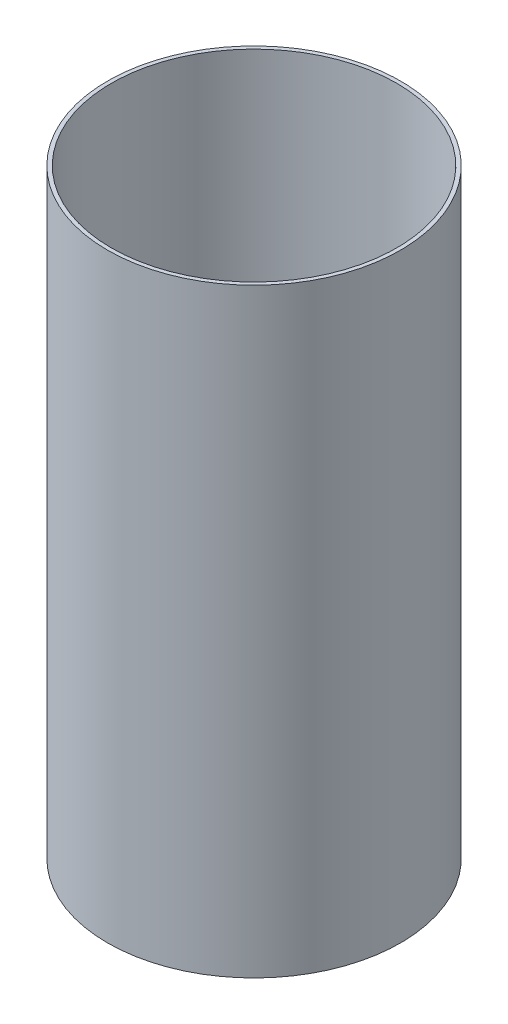
ISO-10303-21;
HEADER;
FILE_DESCRIPTION(('STEP AP214'),'2;1');
FILE_NAME('part.step','',(''),(''),'','','');
FILE_SCHEMA(('AUTOMOTIVE_DESIGN { 1 0 10303 214 1 1 1 1 }'));
ENDSEC;
DATA;
#1=APPLICATION_CONTEXT('core data for automotive mechanical design processes');
#2=APPLICATION_PROTOCOL_DEFINITION('international standard','automotive_design',2000,#1);
#3=PRODUCT_CONTEXT('',#1,'mechanical');
#4=PRODUCT('Part','Part','',(#3));
#5=PRODUCT_RELATED_PRODUCT_CATEGORY('part','',(#4));
#6=PRODUCT_DEFINITION_FORMATION('','',#4);
#7=PRODUCT_DEFINITION_CONTEXT('part definition',#1,'design');
#8=PRODUCT_DEFINITION('design','',#6,#7);
#9=PRODUCT_DEFINITION_SHAPE('','',#8);
#10=(LENGTH_UNIT() NAMED_UNIT(*) SI_UNIT(.MILLI.,.METRE.));
#11=(NAMED_UNIT(*) PLANE_ANGLE_UNIT() SI_UNIT($,.RADIAN.));
#12=(NAMED_UNIT(*) SI_UNIT($,.STERADIAN.) SOLID_ANGLE_UNIT());
#13=UNCERTAINTY_MEASURE_WITH_UNIT(LENGTH_MEASURE(1.E-05),#10,'distance_accuracy_value','');
#14=(GEOMETRIC_REPRESENTATION_CONTEXT(3) GLOBAL_UNCERTAINTY_ASSIGNED_CONTEXT((#13)) GLOBAL_UNIT_ASSIGNED_CONTEXT((#10,
#11,#12)) REPRESENTATION_CONTEXT('',''));
#15=CARTESIAN_POINT('',(0.,0.,0.));
#16=DIRECTION('',(0.,0.,1.));
#17=DIRECTION('',(1.,0.,0.));
#18=AXIS2_PLACEMENT_3D('',#15,#16,#17);
#19=CARTESIAN_POINT('',(0.,312.,0.));
#20=DIRECTION('',(0.,1.,0.));
#21=DIRECTION('',(0.,0.,1.));
#22=AXIS2_PLACEMENT_3D('',#19,#20,#21);
#23=PLANE('',#22);
#24=CARTESIAN_POINT('',(0.,312.,0.));
#25=DIRECTION('',(0.,1.,0.));
#26=DIRECTION('',(0.,0.,1.));
#27=AXIS2_PLACEMENT_3D('',#24,#25,#26);
#28=CIRCLE('',#27,76.2);
#29=CARTESIAN_POINT('',(0.,312.,76.2));
#30=VERTEX_POINT('',#29);
#31=EDGE_CURVE('E10',#30,#30,#28,.T.);
#32=ORIENTED_EDGE('',*,*,#31,.T.);
#33=EDGE_LOOP('',(#32));
#34=FACE_BOUND('',#33,.T.);
#35=CARTESIAN_POINT('',(0.,312.,0.));
#36=DIRECTION('',(0.,1.,0.));
#37=DIRECTION('',(0.,0.,1.));
#38=AXIS2_PLACEMENT_3D('',#35,#36,#37);
#39=CIRCLE('',#38,74.2);
#40=CARTESIAN_POINT('',(0.,312.,74.2));
#41=VERTEX_POINT('',#40);
#42=EDGE_CURVE('E42',#41,#41,#39,.T.);
#43=ORIENTED_EDGE('',*,*,#42,.F.);
#44=EDGE_LOOP('',(#43));
#45=FACE_BOUND('',#44,.T.);
#46=ADVANCED_FACE('F31',(#34,#45),#23,.T.);
#47=CARTESIAN_POINT('',(0.,0.,0.));
#48=DIRECTION('',(0.,1.,0.));
#49=DIRECTION('',(0.,0.,1.));
#50=AXIS2_PLACEMENT_3D('',#47,#48,#49);
#51=PLANE('',#50);
#52=CARTESIAN_POINT('',(0.,0.,0.));
#53=DIRECTION('',(0.,1.,0.));
#54=DIRECTION('',(0.,0.,1.));
#55=AXIS2_PLACEMENT_3D('',#52,#53,#54);
#56=CIRCLE('',#55,76.2);
#57=CARTESIAN_POINT('',(0.,0.,76.2));
#58=VERTEX_POINT('',#57);
#59=EDGE_CURVE('E35',#58,#58,#56,.T.);
#60=ORIENTED_EDGE('',*,*,#59,.F.);
#61=EDGE_LOOP('',(#60));
#62=FACE_BOUND('',#61,.T.);
#63=CARTESIAN_POINT('',(0.,0.,0.));
#64=DIRECTION('',(0.,1.,0.));
#65=DIRECTION('',(0.,0.,1.));
#66=AXIS2_PLACEMENT_3D('',#63,#64,#65);
#67=CIRCLE('',#66,74.2);
#68=CARTESIAN_POINT('',(0.,0.,74.2));
#69=VERTEX_POINT('',#68);
#70=EDGE_CURVE('E44',#69,#69,#67,.T.);
#71=ORIENTED_EDGE('',*,*,#70,.T.);
#72=EDGE_LOOP('',(#71));
#73=FACE_BOUND('',#72,.T.);
#74=ADVANCED_FACE('F54',(#62,#73),#51,.F.);
#75=CARTESIAN_POINT('',(0.,312.,0.));
#76=DIRECTION('',(0.,-1.,0.));
#77=DIRECTION('',(0.,0.,-1.));
#78=AXIS2_PLACEMENT_3D('',#75,#76,#77);
#79=CYLINDRICAL_SURFACE('',#78,76.2);
#80=ORIENTED_EDGE('',*,*,#31,.F.);
#81=EDGE_LOOP('',(#80));
#82=FACE_BOUND('',#81,.T.);
#83=ORIENTED_EDGE('',*,*,#59,.T.);
#84=EDGE_LOOP('',(#83));
#85=FACE_BOUND('',#84,.T.);
#86=ADVANCED_FACE('F33',(#82,#85),#79,.T.);
#87=CARTESIAN_POINT('',(0.,312.,0.));
#88=DIRECTION('',(0.,-1.,0.));
#89=DIRECTION('',(0.,0.,-1.));
#90=AXIS2_PLACEMENT_3D('',#87,#88,#89);
#91=CYLINDRICAL_SURFACE('',#90,74.2);
#92=ORIENTED_EDGE('',*,*,#42,.T.);
#93=EDGE_LOOP('',(#92));
#94=FACE_BOUND('',#93,.T.);
#95=ORIENTED_EDGE('',*,*,#70,.F.);
#96=EDGE_LOOP('',(#95));
#97=FACE_BOUND('',#96,.T.);
#98=ADVANCED_FACE('F50',(#94,#97),#91,.F.);
#99=CLOSED_SHELL('',(#46,#74,#86,#98));
#100=MANIFOLD_SOLID_BREP('B2',#99);
#101=ADVANCED_BREP_SHAPE_REPRESENTATION('',(#18,#100),#14);
#102=SHAPE_DEFINITION_REPRESENTATION(#9,#101);
ENDSEC;
END-ISO-10303-21;
